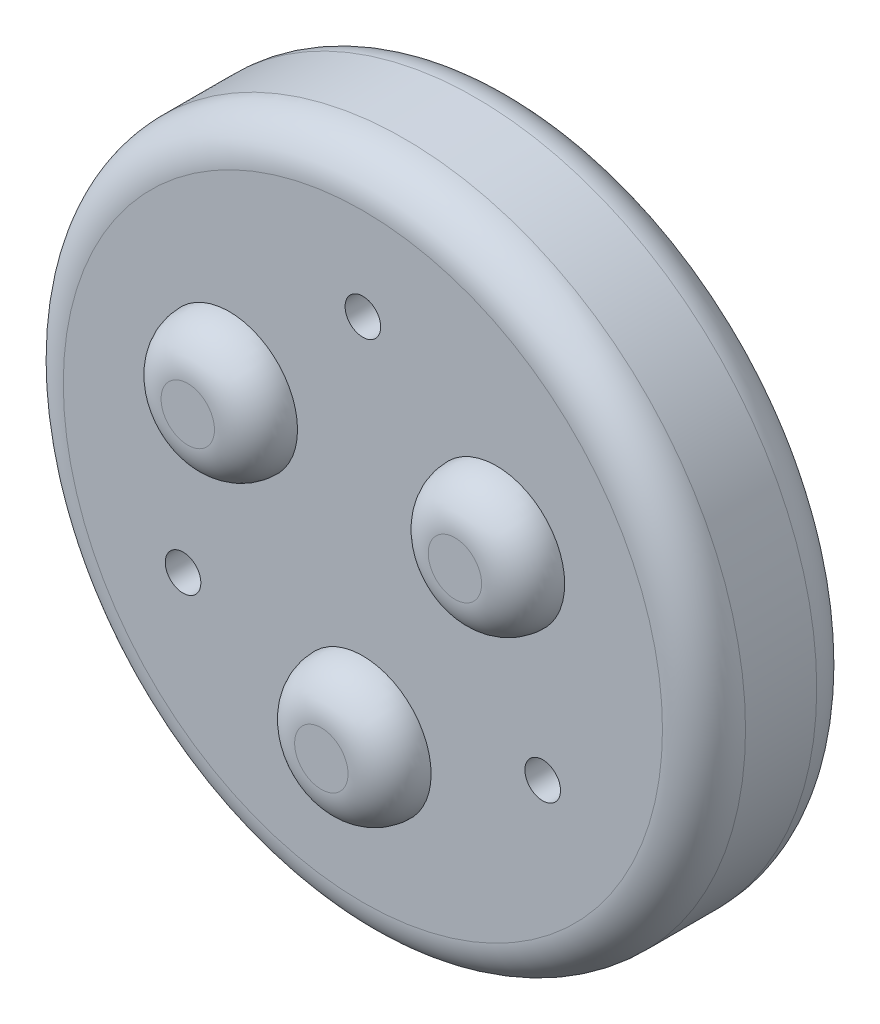
ISO-10303-21;
HEADER;
FILE_DESCRIPTION(('STEP AP214'),'2;1');
FILE_NAME('part.step','',(''),(''),'','','');
FILE_SCHEMA(('AUTOMOTIVE_DESIGN { 1 0 10303 214 1 1 1 1 }'));
ENDSEC;
DATA;
#1=APPLICATION_CONTEXT('core data for automotive mechanical design processes');
#2=APPLICATION_PROTOCOL_DEFINITION('international standard','automotive_design',2000,#1);
#3=PRODUCT_CONTEXT('',#1,'mechanical');
#4=PRODUCT('Part','Part','',(#3));
#5=PRODUCT_RELATED_PRODUCT_CATEGORY('part','',(#4));
#6=PRODUCT_DEFINITION_FORMATION('','',#4);
#7=PRODUCT_DEFINITION_CONTEXT('part definition',#1,'design');
#8=PRODUCT_DEFINITION('design','',#6,#7);
#9=PRODUCT_DEFINITION_SHAPE('','',#8);
#10=(LENGTH_UNIT() NAMED_UNIT(*) SI_UNIT(.MILLI.,.METRE.));
#11=(NAMED_UNIT(*) PLANE_ANGLE_UNIT() SI_UNIT($,.RADIAN.));
#12=(NAMED_UNIT(*) SI_UNIT($,.STERADIAN.) SOLID_ANGLE_UNIT());
#13=UNCERTAINTY_MEASURE_WITH_UNIT(LENGTH_MEASURE(1.E-05),#10,'distance_accuracy_value','');
#14=(GEOMETRIC_REPRESENTATION_CONTEXT(3) GLOBAL_UNCERTAINTY_ASSIGNED_CONTEXT((#13)) GLOBAL_UNIT_ASSIGNED_CONTEXT((#10,
#11,#12)) REPRESENTATION_CONTEXT('',''));
#15=CARTESIAN_POINT('',(0.,0.,0.));
#16=DIRECTION('',(0.,0.,1.));
#17=DIRECTION('',(1.,0.,0.));
#18=AXIS2_PLACEMENT_3D('',#15,#16,#17);
#19=CARTESIAN_POINT('',(0.,-26.,26.));
#20=DIRECTION('',(0.,0.,1.));
#21=DIRECTION('',(1.,0.,0.));
#22=AXIS2_PLACEMENT_3D('',#19,#20,#21);
#23=DEGENERATE_TOROIDAL_SURFACE('',#22,4.5,7.,.T.);
#24=CARTESIAN_POINT('',(0.,-26.,33.));
#25=DIRECTION('',(0.,0.,1.));
#26=DIRECTION('',(1.,0.,0.));
#27=AXIS2_PLACEMENT_3D('',#24,#25,#26);
#28=CIRCLE('',#27,4.5);
#29=CARTESIAN_POINT('',(4.5,-26.,33.));
#30=VERTEX_POINT('',#29);
#31=EDGE_CURVE('E12',#30,#30,#28,.T.);
#32=ORIENTED_EDGE('',*,*,#31,.F.);
#33=EDGE_LOOP('',(#32));
#34=FACE_BOUND('',#33,.T.);
#35=CARTESIAN_POINT('',(0.,-26.,26.));
#36=DIRECTION('',(0.,0.,1.));
#37=DIRECTION('',(1.,0.,0.));
#38=AXIS2_PLACEMENT_3D('',#35,#36,#37);
#39=CIRCLE('',#38,11.5);
#40=CARTESIAN_POINT('',(11.5,-26.,26.));
#41=VERTEX_POINT('',#40);
#42=EDGE_CURVE('E181',#41,#41,#39,.T.);
#43=ORIENTED_EDGE('',*,*,#42,.T.);
#44=EDGE_LOOP('',(#43));
#45=FACE_BOUND('',#44,.T.);
#46=ADVANCED_FACE('F40',(#34,#45),#23,.T.);
#47=CARTESIAN_POINT('',(22.5166604983954,13.,26.));
#48=DIRECTION('',(0.,0.,1.));
#49=DIRECTION('',(1.,0.,0.));
#50=AXIS2_PLACEMENT_3D('',#47,#48,#49);
#51=DEGENERATE_TOROIDAL_SURFACE('',#50,4.5,7.,.T.);
#52=CARTESIAN_POINT('',(22.5166604983954,13.,33.));
#53=DIRECTION('',(0.,0.,1.));
#54=DIRECTION('',(1.,0.,0.));
#55=AXIS2_PLACEMENT_3D('',#52,#53,#54);
#56=CIRCLE('',#55,4.5);
#57=CARTESIAN_POINT('',(27.0166604983954,13.,33.));
#58=VERTEX_POINT('',#57);
#59=EDGE_CURVE('E47',#58,#58,#56,.T.);
#60=ORIENTED_EDGE('',*,*,#59,.F.);
#61=EDGE_LOOP('',(#60));
#62=FACE_BOUND('',#61,.T.);
#63=CARTESIAN_POINT('',(22.5166604983954,13.,26.));
#64=DIRECTION('',(0.,0.,1.));
#65=DIRECTION('',(1.,0.,0.));
#66=AXIS2_PLACEMENT_3D('',#63,#64,#65);
#67=CIRCLE('',#66,11.5);
#68=CARTESIAN_POINT('',(34.0166604983954,13.,26.));
#69=VERTEX_POINT('',#68);
#70=EDGE_CURVE('E178',#69,#69,#67,.T.);
#71=ORIENTED_EDGE('',*,*,#70,.T.);
#72=EDGE_LOOP('',(#71));
#73=FACE_BOUND('',#72,.T.);
#74=ADVANCED_FACE('F172',(#62,#73),#51,.T.);
#75=CARTESIAN_POINT('',(-22.5166604983955,12.9999999999999,26.));
#76=DIRECTION('',(0.,0.,1.));
#77=DIRECTION('',(1.,0.,0.));
#78=AXIS2_PLACEMENT_3D('',#75,#76,#77);
#79=DEGENERATE_TOROIDAL_SURFACE('',#78,4.5,7.,.T.);
#80=CARTESIAN_POINT('',(-22.5166604983955,12.9999999999999,33.));
#81=DIRECTION('',(0.,0.,1.));
#82=DIRECTION('',(1.,0.,0.));
#83=AXIS2_PLACEMENT_3D('',#80,#81,#82);
#84=CIRCLE('',#83,4.5);
#85=CARTESIAN_POINT('',(-18.0166604983955,12.9999999999999,33.));
#86=VERTEX_POINT('',#85);
#87=EDGE_CURVE('E165',#86,#86,#84,.T.);
#88=ORIENTED_EDGE('',*,*,#87,.F.);
#89=EDGE_LOOP('',(#88));
#90=FACE_BOUND('',#89,.T.);
#91=CARTESIAN_POINT('',(-22.5166604983955,12.9999999999999,26.));
#92=DIRECTION('',(0.,0.,1.));
#93=DIRECTION('',(1.,0.,0.));
#94=AXIS2_PLACEMENT_3D('',#91,#92,#93);
#95=CIRCLE('',#94,11.5);
#96=CARTESIAN_POINT('',(-11.0166604983955,12.9999999999999,26.));
#97=VERTEX_POINT('',#96);
#98=EDGE_CURVE('E180',#97,#97,#95,.T.);
#99=ORIENTED_EDGE('',*,*,#98,.T.);
#100=EDGE_LOOP('',(#99));
#101=FACE_BOUND('',#100,.T.);
#102=ADVANCED_FACE('F175',(#90,#101),#79,.T.);
#103=CARTESIAN_POINT('',(5.,29.,8.5));
#104=DIRECTION('',(0.,0.,1.));
#105=DIRECTION('',(1.,0.,0.));
#106=AXIS2_PLACEMENT_3D('',#103,#104,#105);
#107=CYLINDRICAL_SURFACE('',#106,3.);
#108=DIRECTION('',(0.,0.,-1.));
#109=VECTOR('',#108,1.);
#110=CARTESIAN_POINT('',(5.,26.,8.5));
#111=LINE('',#110,#109);
#112=CARTESIAN_POINT('',(5.,26.,8.5));
#113=VERTEX_POINT('',#112);
#114=CARTESIAN_POINT('',(5.,26.,0.));
#115=VERTEX_POINT('',#114);
#116=EDGE_CURVE('E158',#113,#115,#111,.T.);
#117=ORIENTED_EDGE('',*,*,#116,.F.);
#118=CARTESIAN_POINT('',(5.,29.,8.5));
#119=DIRECTION('',(0.,0.,1.));
#120=DIRECTION('',(1.,0.,0.));
#121=AXIS2_PLACEMENT_3D('',#118,#119,#120);
#122=CIRCLE('',#121,3.);
#123=CARTESIAN_POINT('',(8.,29.,8.5));
#124=VERTEX_POINT('',#123);
#125=EDGE_CURVE('E61',#124,#113,#122,.F.);
#126=ORIENTED_EDGE('',*,*,#125,.F.);
#127=DIRECTION('',(0.,0.,-1.));
#128=VECTOR('',#127,1.);
#129=CARTESIAN_POINT('',(8.,29.,8.5));
#130=LINE('',#129,#128);
#131=CARTESIAN_POINT('',(8.,29.,0.));
#132=VERTEX_POINT('',#131);
#133=EDGE_CURVE('E161',#132,#124,#130,.F.);
#134=ORIENTED_EDGE('',*,*,#133,.F.);
#135=CARTESIAN_POINT('',(5.,29.,0.));
#136=DIRECTION('',(0.,0.,1.));
#137=DIRECTION('',(1.,0.,0.));
#138=AXIS2_PLACEMENT_3D('',#135,#136,#137);
#139=CIRCLE('',#138,3.);
#140=EDGE_CURVE('E54',#132,#115,#139,.F.);
#141=ORIENTED_EDGE('',*,*,#140,.T.);
#142=EDGE_LOOP('',(#117,#126,#134,#141));
#143=FACE_BOUND('',#142,.T.);
#144=ADVANCED_FACE('F342',(#143),#107,.F.);
#145=CARTESIAN_POINT('',(-5.,29.,8.5));
#146=DIRECTION('',(0.,0.,-1.));
#147=DIRECTION('',(-1.,0.,0.));
#148=AXIS2_PLACEMENT_3D('',#145,#146,#147);
#149=CYLINDRICAL_SURFACE('',#148,3.);
#150=DIRECTION('',(0.,0.,-1.));
#151=VECTOR('',#150,1.);
#152=CARTESIAN_POINT('',(-8.,29.,8.5));
#153=LINE('',#152,#151);
#154=CARTESIAN_POINT('',(-8.,29.,8.5));
#155=VERTEX_POINT('',#154);
#156=CARTESIAN_POINT('',(-8.,29.,0.));
#157=VERTEX_POINT('',#156);
#158=EDGE_CURVE('E148',#155,#157,#153,.T.);
#159=ORIENTED_EDGE('',*,*,#158,.F.);
#160=CARTESIAN_POINT('',(-5.,29.,8.5));
#161=DIRECTION('',(0.,0.,1.));
#162=DIRECTION('',(1.,0.,0.));
#163=AXIS2_PLACEMENT_3D('',#160,#161,#162);
#164=CIRCLE('',#163,3.);
#165=CARTESIAN_POINT('',(-5.,26.,8.5));
#166=VERTEX_POINT('',#165);
#167=EDGE_CURVE('E154',#166,#155,#164,.F.);
#168=ORIENTED_EDGE('',*,*,#167,.F.);
#169=DIRECTION('',(0.,0.,-1.));
#170=VECTOR('',#169,1.);
#171=CARTESIAN_POINT('',(-5.,26.,8.5));
#172=LINE('',#171,#170);
#173=CARTESIAN_POINT('',(-5.,26.,0.));
#174=VERTEX_POINT('',#173);
#175=EDGE_CURVE('E151',#174,#166,#172,.F.);
#176=ORIENTED_EDGE('',*,*,#175,.F.);
#177=CARTESIAN_POINT('',(-5.,29.,0.));
#178=DIRECTION('',(0.,0.,1.));
#179=DIRECTION('',(1.,0.,0.));
#180=AXIS2_PLACEMENT_3D('',#177,#178,#179);
#181=CIRCLE('',#180,3.);
#182=EDGE_CURVE('E156',#174,#157,#181,.F.);
#183=ORIENTED_EDGE('',*,*,#182,.T.);
#184=EDGE_LOOP('',(#159,#168,#176,#183));
#185=FACE_BOUND('',#184,.T.);
#186=ADVANCED_FACE('F353',(#185),#149,.F.);
#187=CARTESIAN_POINT('',(-5.,40.,8.5));
#188=DIRECTION('',(0.,0.,-1.));
#189=DIRECTION('',(-1.,0.,0.));
#190=AXIS2_PLACEMENT_3D('',#187,#188,#189);
#191=CYLINDRICAL_SURFACE('',#190,3.);
#192=DIRECTION('',(0.,0.,-1.));
#193=VECTOR('',#192,1.);
#194=CARTESIAN_POINT('',(-5.,43.,8.5));
#195=LINE('',#194,#193);
#196=CARTESIAN_POINT('',(-5.,43.,8.5));
#197=VERTEX_POINT('',#196);
#198=CARTESIAN_POINT('',(-5.,43.,0.));
#199=VERTEX_POINT('',#198);
#200=EDGE_CURVE('E121',#197,#199,#195,.T.);
#201=ORIENTED_EDGE('',*,*,#200,.F.);
#202=CARTESIAN_POINT('',(-5.,40.,8.5));
#203=DIRECTION('',(0.,0.,1.));
#204=DIRECTION('',(1.,0.,0.));
#205=AXIS2_PLACEMENT_3D('',#202,#203,#204);
#206=CIRCLE('',#205,3.);
#207=CARTESIAN_POINT('',(-8.,40.,8.5));
#208=VERTEX_POINT('',#207);
#209=EDGE_CURVE('E144',#208,#197,#206,.F.);
#210=ORIENTED_EDGE('',*,*,#209,.F.);
#211=DIRECTION('',(0.,0.,-1.));
#212=VECTOR('',#211,1.);
#213=CARTESIAN_POINT('',(-8.,40.,8.5));
#214=LINE('',#213,#212);
#215=CARTESIAN_POINT('',(-8.,40.,0.));
#216=VERTEX_POINT('',#215);
#217=EDGE_CURVE('E141',#216,#208,#214,.F.);
#218=ORIENTED_EDGE('',*,*,#217,.F.);
#219=CARTESIAN_POINT('',(-5.,40.,0.));
#220=DIRECTION('',(0.,0.,1.));
#221=DIRECTION('',(1.,0.,0.));
#222=AXIS2_PLACEMENT_3D('',#219,#220,#221);
#223=CIRCLE('',#222,3.);
#224=EDGE_CURVE('E146',#216,#199,#223,.F.);
#225=ORIENTED_EDGE('',*,*,#224,.T.);
#226=EDGE_LOOP('',(#201,#210,#218,#225));
#227=FACE_BOUND('',#226,.T.);
#228=ADVANCED_FACE('F362',(#227),#191,.F.);
#229=CARTESIAN_POINT('',(5.,40.,8.5));
#230=DIRECTION('',(0.,0.,1.));
#231=DIRECTION('',(1.,0.,0.));
#232=AXIS2_PLACEMENT_3D('',#229,#230,#231);
#233=CYLINDRICAL_SURFACE('',#232,3.);
#234=DIRECTION('',(0.,0.,-1.));
#235=VECTOR('',#234,1.);
#236=CARTESIAN_POINT('',(8.,40.,8.5));
#237=LINE('',#236,#235);
#238=CARTESIAN_POINT('',(8.,40.,8.5));
#239=VERTEX_POINT('',#238);
#240=CARTESIAN_POINT('',(8.,40.,0.));
#241=VERTEX_POINT('',#240);
#242=EDGE_CURVE('E117',#239,#241,#237,.T.);
#243=ORIENTED_EDGE('',*,*,#242,.F.);
#244=CARTESIAN_POINT('',(5.,40.,8.5));
#245=DIRECTION('',(0.,0.,1.));
#246=DIRECTION('',(1.,0.,0.));
#247=AXIS2_PLACEMENT_3D('',#244,#245,#246);
#248=CIRCLE('',#247,3.);
#249=CARTESIAN_POINT('',(5.,43.,8.5));
#250=VERTEX_POINT('',#249);
#251=EDGE_CURVE('E122',#250,#239,#248,.F.);
#252=ORIENTED_EDGE('',*,*,#251,.F.);
#253=DIRECTION('',(0.,0.,-1.));
#254=VECTOR('',#253,1.);
#255=CARTESIAN_POINT('',(5.,43.,8.5));
#256=LINE('',#255,#254);
#257=CARTESIAN_POINT('',(5.,43.,0.));
#258=VERTEX_POINT('',#257);
#259=EDGE_CURVE('E119',#258,#250,#256,.F.);
#260=ORIENTED_EDGE('',*,*,#259,.F.);
#261=CARTESIAN_POINT('',(5.,40.,0.));
#262=DIRECTION('',(0.,0.,1.));
#263=DIRECTION('',(1.,0.,0.));
#264=AXIS2_PLACEMENT_3D('',#261,#262,#263);
#265=CIRCLE('',#264,3.);
#266=EDGE_CURVE('E107',#258,#241,#265,.F.);
#267=ORIENTED_EDGE('',*,*,#266,.T.);
#268=EDGE_LOOP('',(#243,#252,#260,#267));
#269=FACE_BOUND('',#268,.T.);
#270=ADVANCED_FACE('F116',(#269),#233,.F.);
#271=CARTESIAN_POINT('',(0.,35.,91.5));
#272=DIRECTION('',(0.,0.,-1.));
#273=DIRECTION('',(-1.,0.,0.));
#274=AXIS2_PLACEMENT_3D('',#271,#272,#273);
#275=CYLINDRICAL_SURFACE('',#274,1.5);
#276=CARTESIAN_POINT('',(0.,35.,14.));
#277=DIRECTION('',(0.,0.,1.));
#278=DIRECTION('',(1.,0.,0.));
#279=AXIS2_PLACEMENT_3D('',#276,#277,#278);
#280=CIRCLE('',#279,1.5);
#281=CARTESIAN_POINT('',(1.5,35.,14.));
#282=VERTEX_POINT('',#281);
#283=EDGE_CURVE('E207',#282,#282,#280,.T.);
#284=ORIENTED_EDGE('',*,*,#283,.F.);
#285=EDGE_LOOP('',(#284));
#286=FACE_BOUND('',#285,.T.);
#287=CARTESIAN_POINT('',(0.,35.,15.));
#288=DIRECTION('',(0.,0.,1.));
#289=DIRECTION('',(1.,0.,0.));
#290=AXIS2_PLACEMENT_3D('',#287,#288,#289);
#291=CIRCLE('',#290,1.5);
#292=CARTESIAN_POINT('',(1.5,35.,15.));
#293=VERTEX_POINT('',#292);
#294=EDGE_CURVE('E203',#293,#293,#291,.T.);
#295=ORIENTED_EDGE('',*,*,#294,.T.);
#296=EDGE_LOOP('',(#295));
#297=FACE_BOUND('',#296,.T.);
#298=ADVANCED_FACE('F380',(#286,#297),#275,.F.);
#299=CARTESIAN_POINT('',(0.,0.,0.));
#300=DIRECTION('',(0.,0.,1.));
#301=DIRECTION('',(1.,0.,0.));
#302=AXIS2_PLACEMENT_3D('',#299,#300,#301);
#303=PLANE('',#302);
#304=ORIENTED_EDGE('',*,*,#140,.F.);
#305=DIRECTION('',(0.,1.,0.));
#306=VECTOR('',#305,1.);
#307=CARTESIAN_POINT('',(8.,26.,0.));
#308=LINE('',#307,#306);
#309=EDGE_CURVE('E102',#132,#241,#308,.T.);
#310=ORIENTED_EDGE('',*,*,#309,.T.);
#311=ORIENTED_EDGE('',*,*,#266,.F.);
#312=DIRECTION('',(-1.,0.,0.));
#313=VECTOR('',#312,1.);
#314=CARTESIAN_POINT('',(8.,43.,0.));
#315=LINE('',#314,#313);
#316=EDGE_CURVE('E111',#258,#199,#315,.T.);
#317=ORIENTED_EDGE('',*,*,#316,.T.);
#318=ORIENTED_EDGE('',*,*,#224,.F.);
#319=DIRECTION('',(0.,1.,0.));
#320=VECTOR('',#319,1.);
#321=CARTESIAN_POINT('',(-8.,26.,0.));
#322=LINE('',#321,#320);
#323=EDGE_CURVE('E219',#157,#216,#322,.T.);
#324=ORIENTED_EDGE('',*,*,#323,.F.);
#325=ORIENTED_EDGE('',*,*,#182,.F.);
#326=DIRECTION('',(1.,0.,0.));
#327=VECTOR('',#326,1.);
#328=CARTESIAN_POINT('',(0.,26.,0.));
#329=LINE('',#328,#327);
#330=EDGE_CURVE('E210',#174,#115,#329,.T.);
#331=ORIENTED_EDGE('',*,*,#330,.T.);
#332=EDGE_LOOP('',(#304,#310,#311,#317,#318,#324,#325,#331));
#333=FACE_BOUND('',#332,.T.);
#334=CARTESIAN_POINT('',(0.,0.,0.));
#335=DIRECTION('',(0.,0.,1.));
#336=DIRECTION('',(1.,0.,0.));
#337=AXIS2_PLACEMENT_3D('',#334,#335,#336);
#338=CIRCLE('',#337,50.5);
#339=CARTESIAN_POINT('',(50.5,0.,0.));
#340=VERTEX_POINT('',#339);
#341=EDGE_CURVE('E132',#340,#340,#338,.F.);
#342=ORIENTED_EDGE('',*,*,#341,.T.);
#343=EDGE_LOOP('',(#342));
#344=FACE_BOUND('',#343,.T.);
#345=ADVANCED_FACE('F104',(#333,#344),#303,.F.);
#346=CARTESIAN_POINT('',(0.,0.,26.));
#347=DIRECTION('',(0.,0.,-1.));
#348=DIRECTION('',(-1.,0.,0.));
#349=AXIS2_PLACEMENT_3D('',#346,#347,#348);
#350=CYLINDRICAL_SURFACE('',#349,57.5);
#351=CARTESIAN_POINT('',(0.,0.,7.));
#352=DIRECTION('',(0.,0.,1.));
#353=DIRECTION('',(1.,0.,0.));
#354=AXIS2_PLACEMENT_3D('',#351,#352,#353);
#355=CIRCLE('',#354,57.5);
#356=CARTESIAN_POINT('',(-57.5,0.,7.));
#357=VERTEX_POINT('',#356);
#358=EDGE_CURVE('E224',#357,#357,#355,.T.);
#359=CARTESIAN_POINT('',(0.,0.,19.));
#360=DIRECTION('',(0.,0.,1.));
#361=DIRECTION('',(1.,0.,0.));
#362=AXIS2_PLACEMENT_3D('',#359,#360,#361);
#363=CIRCLE('',#362,57.5);
#364=CARTESIAN_POINT('',(-57.5,0.,19.));
#365=VERTEX_POINT('',#364);
#366=EDGE_CURVE('E216',#365,#365,#363,.F.);
#367=CARTESIAN_POINT('',(-57.5,0.,7.));
#368=CARTESIAN_POINT('',(-57.5,0.,7.125));
#369=CARTESIAN_POINT('',(-57.5,0.,7.25));
#370=CARTESIAN_POINT('',(-57.5,0.,7.5));
#371=CARTESIAN_POINT('',(-57.5,0.,7.625));
#372=CARTESIAN_POINT('',(-57.5,0.,7.875));
#373=CARTESIAN_POINT('',(-57.5,0.,8.));
#374=CARTESIAN_POINT('',(-57.5,0.,8.25));
#375=CARTESIAN_POINT('',(-57.5,0.,8.375));
#376=CARTESIAN_POINT('',(-57.5,0.,8.625));
#377=CARTESIAN_POINT('',(-57.5,0.,8.75));
#378=CARTESIAN_POINT('',(-57.5,0.,9.));
#379=CARTESIAN_POINT('',(-57.5,0.,9.125));
#380=CARTESIAN_POINT('',(-57.5,0.,9.375));
#381=CARTESIAN_POINT('',(-57.5,0.,9.5));
#382=CARTESIAN_POINT('',(-57.5,0.,9.75));
#383=CARTESIAN_POINT('',(-57.5,0.,9.875));
#384=CARTESIAN_POINT('',(-57.5,0.,10.125));
#385=CARTESIAN_POINT('',(-57.5,0.,10.25));
#386=CARTESIAN_POINT('',(-57.5,0.,10.5));
#387=CARTESIAN_POINT('',(-57.5,0.,10.625));
#388=CARTESIAN_POINT('',(-57.5,0.,10.875));
#389=CARTESIAN_POINT('',(-57.5,0.,11.));
#390=CARTESIAN_POINT('',(-57.5,0.,11.25));
#391=CARTESIAN_POINT('',(-57.5,0.,11.375));
#392=CARTESIAN_POINT('',(-57.5,0.,11.625));
#393=CARTESIAN_POINT('',(-57.5,0.,11.75));
#394=CARTESIAN_POINT('',(-57.5,0.,12.));
#395=CARTESIAN_POINT('',(-57.5,0.,12.125));
#396=CARTESIAN_POINT('',(-57.5,0.,12.375));
#397=CARTESIAN_POINT('',(-57.5,0.,12.5));
#398=CARTESIAN_POINT('',(-57.5,0.,12.75));
#399=CARTESIAN_POINT('',(-57.5,0.,12.875));
#400=CARTESIAN_POINT('',(-57.5,0.,13.125));
#401=CARTESIAN_POINT('',(-57.5,0.,13.25));
#402=CARTESIAN_POINT('',(-57.5,0.,13.5));
#403=CARTESIAN_POINT('',(-57.5,0.,13.625));
#404=CARTESIAN_POINT('',(-57.5,0.,13.875));
#405=CARTESIAN_POINT('',(-57.5,0.,14.));
#406=CARTESIAN_POINT('',(-57.5,0.,14.25));
#407=CARTESIAN_POINT('',(-57.5,0.,14.375));
#408=CARTESIAN_POINT('',(-57.5,0.,14.625));
#409=CARTESIAN_POINT('',(-57.5,0.,14.75));
#410=CARTESIAN_POINT('',(-57.5,0.,15.));
#411=CARTESIAN_POINT('',(-57.5,0.,15.125));
#412=CARTESIAN_POINT('',(-57.5,0.,15.375));
#413=CARTESIAN_POINT('',(-57.5,0.,15.5));
#414=CARTESIAN_POINT('',(-57.5,0.,15.75));
#415=CARTESIAN_POINT('',(-57.5,0.,15.875));
#416=CARTESIAN_POINT('',(-57.5,0.,16.125));
#417=CARTESIAN_POINT('',(-57.5,0.,16.25));
#418=CARTESIAN_POINT('',(-57.5,0.,16.5));
#419=CARTESIAN_POINT('',(-57.5,0.,16.625));
#420=CARTESIAN_POINT('',(-57.5,0.,16.875));
#421=CARTESIAN_POINT('',(-57.5,0.,17.));
#422=CARTESIAN_POINT('',(-57.5,0.,17.25));
#423=CARTESIAN_POINT('',(-57.5,0.,17.375));
#424=CARTESIAN_POINT('',(-57.5,0.,17.625));
#425=CARTESIAN_POINT('',(-57.5,0.,17.75));
#426=CARTESIAN_POINT('',(-57.5,0.,18.));
#427=CARTESIAN_POINT('',(-57.5,0.,18.125));
#428=CARTESIAN_POINT('',(-57.5,0.,18.375));
#429=CARTESIAN_POINT('',(-57.5,0.,18.5));
#430=CARTESIAN_POINT('',(-57.5,0.,18.75));
#431=CARTESIAN_POINT('',(-57.5,0.,18.875));
#432=CARTESIAN_POINT('',(-57.5,0.,19.));
#433=B_SPLINE_CURVE_WITH_KNOTS('',3,(#367,#368,#369,#370,#371,#372,#373,#374,#375,#376,#377,
#378,#379,#380,#381,#382,#383,#384,#385,#386,#387,#388,#389,#390,#391,#392,#393,#394,#395,#396,
#397,#398,#399,#400,#401,#402,#403,#404,#405,#406,#407,#408,#409,#410,#411,#412,#413,#414,#415,
#416,#417,#418,#419,#420,#421,#422,#423,#424,#425,#426,#427,#428,#429,#430,#431,#432),
.UNSPECIFIED.,.F.,.F.,(4,2,2,2,2,2,2,2,2,2,2,2,2,2,2,2,2,2,2,2,2,2,2,2,2,2,2,2,2,2,2,2,4),(0.,
0.375,0.750000000000001,1.125,1.5,1.875,2.25,2.625,3.,3.375,3.75,4.125,4.5,4.875,5.25,5.625,6.,
6.375,6.75,7.125,7.5,7.875,8.25,8.625,9.,9.375,9.75,10.125,10.5,10.875,11.25,11.625,12.),.UNSPECIFIED.);
#434=EDGE_CURVE('BSEAM270',#357,#365,#433,.T.);
#435=ORIENTED_EDGE('',*,*,#358,.T.);
#436=ORIENTED_EDGE('',*,*,#366,.T.);
#437=ORIENTED_EDGE('',*,*,#434,.T.);
#438=ORIENTED_EDGE('',*,*,#434,.F.);
#439=EDGE_LOOP('',(#435,#437,#436,#438));
#440=FACE_BOUND('',#439,.T.);
#441=ADVANCED_FACE('F270',(#440),#350,.T.);
#442=CARTESIAN_POINT('',(0.,0.,26.));
#443=DIRECTION('',(0.,0.,1.));
#444=DIRECTION('',(1.,0.,0.));
#445=AXIS2_PLACEMENT_3D('',#442,#443,#444);
#446=PLANE('',#445);
#447=ORIENTED_EDGE('',*,*,#42,.F.);
#448=EDGE_LOOP('',(#447));
#449=FACE_BOUND('',#448,.T.);
#450=ORIENTED_EDGE('',*,*,#70,.F.);
#451=EDGE_LOOP('',(#450));
#452=FACE_BOUND('',#451,.T.);
#453=ORIENTED_EDGE('',*,*,#98,.F.);
#454=EDGE_LOOP('',(#453));
#455=FACE_BOUND('',#454,.T.);
#456=CARTESIAN_POINT('',(-30.3108891324555,-17.4999999999998,26.));
#457=DIRECTION('',(0.,0.,1.));
#458=DIRECTION('',(1.,0.,0.));
#459=AXIS2_PLACEMENT_3D('',#456,#457,#458);
#460=CIRCLE('',#459,3.);
#461=CARTESIAN_POINT('',(-27.3108891324555,-17.4999999999998,26.));
#462=VERTEX_POINT('',#461);
#463=EDGE_CURVE('E193',#462,#462,#460,.T.);
#464=ORIENTED_EDGE('',*,*,#463,.F.);
#465=EDGE_LOOP('',(#464));
#466=FACE_BOUND('',#465,.T.);
#467=CARTESIAN_POINT('',(30.3108891324555,-17.4999999999998,26.));
#468=DIRECTION('',(0.,0.,1.));
#469=DIRECTION('',(1.,0.,0.));
#470=AXIS2_PLACEMENT_3D('',#467,#468,#469);
#471=CIRCLE('',#470,2.99999999999999);
#472=CARTESIAN_POINT('',(33.3108891324555,-17.4999999999998,26.));
#473=VERTEX_POINT('',#472);
#474=EDGE_CURVE('E196',#473,#473,#471,.T.);
#475=ORIENTED_EDGE('',*,*,#474,.F.);
#476=EDGE_LOOP('',(#475));
#477=FACE_BOUND('',#476,.T.);
#478=CARTESIAN_POINT('',(0.,35.,26.));
#479=DIRECTION('',(0.,0.,1.));
#480=DIRECTION('',(1.,0.,0.));
#481=AXIS2_PLACEMENT_3D('',#478,#479,#480);
#482=CIRCLE('',#481,3.);
#483=CARTESIAN_POINT('',(3.,35.,26.));
#484=VERTEX_POINT('',#483);
#485=EDGE_CURVE('E135',#484,#484,#482,.F.);
#486=ORIENTED_EDGE('',*,*,#485,.T.);
#487=EDGE_LOOP('',(#486));
#488=FACE_BOUND('',#487,.T.);
#489=CARTESIAN_POINT('',(0.,0.,26.));
#490=DIRECTION('',(0.,0.,1.));
#491=DIRECTION('',(1.,0.,0.));
#492=AXIS2_PLACEMENT_3D('',#489,#490,#491);
#493=CIRCLE('',#492,50.5);
#494=CARTESIAN_POINT('',(50.5,0.,26.));
#495=VERTEX_POINT('',#494);
#496=EDGE_CURVE('E128',#495,#495,#493,.T.);
#497=ORIENTED_EDGE('',*,*,#496,.T.);
#498=EDGE_LOOP('',(#497));
#499=FACE_BOUND('',#498,.T.);
#500=ADVANCED_FACE('F238',(#449,#452,#455,#466,#477,#488,#499),#446,.T.);
#501=CARTESIAN_POINT('',(0.,0.,7.));
#502=DIRECTION('',(0.,0.,1.));
#503=DIRECTION('',(1.,0.,0.));
#504=AXIS2_PLACEMENT_3D('',#501,#502,#503);
#505=TOROIDAL_SURFACE('',#504,50.5,7.);
#506=ORIENTED_EDGE('',*,*,#341,.F.);
#507=EDGE_LOOP('',(#506));
#508=FACE_BOUND('',#507,.T.);
#509=ORIENTED_EDGE('',*,*,#358,.F.);
#510=EDGE_LOOP('',(#509));
#511=FACE_BOUND('',#510,.T.);
#512=ADVANCED_FACE('F269',(#508,#511),#505,.T.);
#513=CARTESIAN_POINT('',(0.,0.,19.));
#514=DIRECTION('',(0.,0.,1.));
#515=DIRECTION('',(1.,0.,0.));
#516=AXIS2_PLACEMENT_3D('',#513,#514,#515);
#517=TOROIDAL_SURFACE('',#516,50.5,7.);
#518=ORIENTED_EDGE('',*,*,#366,.F.);
#519=EDGE_LOOP('',(#518));
#520=FACE_BOUND('',#519,.T.);
#521=ORIENTED_EDGE('',*,*,#496,.F.);
#522=EDGE_LOOP('',(#521));
#523=FACE_BOUND('',#522,.T.);
#524=ADVANCED_FACE('F413',(#520,#523),#517,.T.);
#525=CARTESIAN_POINT('',(8.,26.,8.5));
#526=DIRECTION('',(-1.,0.,0.));
#527=DIRECTION('',(0.,-1.,0.));
#528=AXIS2_PLACEMENT_3D('',#525,#526,#527);
#529=PLANE('',#528);
#530=ORIENTED_EDGE('',*,*,#309,.F.);
#531=ORIENTED_EDGE('',*,*,#133,.T.);
#532=DIRECTION('',(0.,1.,0.));
#533=VECTOR('',#532,1.);
#534=CARTESIAN_POINT('',(8.,26.,8.5));
#535=LINE('',#534,#533);
#536=EDGE_CURVE('E126',#124,#239,#535,.T.);
#537=ORIENTED_EDGE('',*,*,#536,.T.);
#538=ORIENTED_EDGE('',*,*,#242,.T.);
#539=EDGE_LOOP('',(#530,#531,#537,#538));
#540=FACE_BOUND('',#539,.T.);
#541=ADVANCED_FACE('F124',(#540),#529,.T.);
#542=CARTESIAN_POINT('',(8.,43.,8.5));
#543=DIRECTION('',(0.,-1.,0.));
#544=DIRECTION('',(0.,0.,-1.));
#545=AXIS2_PLACEMENT_3D('',#542,#543,#544);
#546=PLANE('',#545);
#547=DIRECTION('',(-1.,0.,0.));
#548=VECTOR('',#547,1.);
#549=CARTESIAN_POINT('',(8.,43.,8.5));
#550=LINE('',#549,#548);
#551=EDGE_CURVE('E209',#250,#197,#550,.T.);
#552=ORIENTED_EDGE('',*,*,#551,.T.);
#553=ORIENTED_EDGE('',*,*,#200,.T.);
#554=ORIENTED_EDGE('',*,*,#316,.F.);
#555=ORIENTED_EDGE('',*,*,#259,.T.);
#556=EDGE_LOOP('',(#552,#553,#554,#555));
#557=FACE_BOUND('',#556,.T.);
#558=ADVANCED_FACE('F426',(#557),#546,.T.);
#559=CARTESIAN_POINT('',(-8.,26.,8.5));
#560=DIRECTION('',(-1.,0.,0.));
#561=DIRECTION('',(0.,0.,1.));
#562=AXIS2_PLACEMENT_3D('',#559,#560,#561);
#563=PLANE('',#562);
#564=DIRECTION('',(0.,1.,0.));
#565=VECTOR('',#564,1.);
#566=CARTESIAN_POINT('',(-8.,26.,8.5));
#567=LINE('',#566,#565);
#568=EDGE_CURVE('E213',#155,#208,#567,.T.);
#569=ORIENTED_EDGE('',*,*,#568,.F.);
#570=ORIENTED_EDGE('',*,*,#158,.T.);
#571=ORIENTED_EDGE('',*,*,#323,.T.);
#572=ORIENTED_EDGE('',*,*,#217,.T.);
#573=EDGE_LOOP('',(#569,#570,#571,#572));
#574=FACE_BOUND('',#573,.T.);
#575=ADVANCED_FACE('F432',(#574),#563,.F.);
#576=CARTESIAN_POINT('',(0.,26.,8.5));
#577=DIRECTION('',(0.,1.,0.));
#578=DIRECTION('',(0.,0.,1.));
#579=AXIS2_PLACEMENT_3D('',#576,#577,#578);
#580=PLANE('',#579);
#581=DIRECTION('',(-1.,0.,0.));
#582=VECTOR('',#581,1.);
#583=CARTESIAN_POINT('',(0.,26.,8.5));
#584=LINE('',#583,#582);
#585=EDGE_CURVE('E215',#113,#166,#584,.T.);
#586=ORIENTED_EDGE('',*,*,#585,.F.);
#587=ORIENTED_EDGE('',*,*,#116,.T.);
#588=ORIENTED_EDGE('',*,*,#330,.F.);
#589=ORIENTED_EDGE('',*,*,#175,.T.);
#590=EDGE_LOOP('',(#586,#587,#588,#589));
#591=FACE_BOUND('',#590,.T.);
#592=ADVANCED_FACE('F439',(#591),#580,.T.);
#593=CARTESIAN_POINT('',(0.,0.,8.5));
#594=DIRECTION('',(0.,0.,1.));
#595=DIRECTION('',(1.,0.,0.));
#596=AXIS2_PLACEMENT_3D('',#593,#594,#595);
#597=PLANE('',#596);
#598=CARTESIAN_POINT('',(0.,35.,8.5));
#599=DIRECTION('',(0.,0.,1.));
#600=DIRECTION('',(1.,0.,0.));
#601=AXIS2_PLACEMENT_3D('',#598,#599,#600);
#602=CIRCLE('',#601,3.);
#603=CARTESIAN_POINT('',(3.,35.,8.5));
#604=VERTEX_POINT('',#603);
#605=EDGE_CURVE('E112',#604,#604,#602,.F.);
#606=ORIENTED_EDGE('',*,*,#605,.F.);
#607=EDGE_LOOP('',(#606));
#608=FACE_BOUND('',#607,.T.);
#609=ORIENTED_EDGE('',*,*,#536,.F.);
#610=ORIENTED_EDGE('',*,*,#125,.T.);
#611=ORIENTED_EDGE('',*,*,#585,.T.);
#612=ORIENTED_EDGE('',*,*,#167,.T.);
#613=ORIENTED_EDGE('',*,*,#568,.T.);
#614=ORIENTED_EDGE('',*,*,#209,.T.);
#615=ORIENTED_EDGE('',*,*,#551,.F.);
#616=ORIENTED_EDGE('',*,*,#251,.T.);
#617=EDGE_LOOP('',(#609,#610,#611,#612,#613,#614,#615,#616));
#618=FACE_BOUND('',#617,.T.);
#619=ADVANCED_FACE('F446',(#608,#618),#597,.F.);
#620=CARTESIAN_POINT('',(0.,35.,14.));
#621=DIRECTION('',(0.,0.,-1.));
#622=DIRECTION('',(-1.,0.,0.));
#623=AXIS2_PLACEMENT_3D('',#620,#621,#622);
#624=CYLINDRICAL_SURFACE('',#623,3.);
#625=CARTESIAN_POINT('',(0.,35.,14.));
#626=DIRECTION('',(0.,0.,1.));
#627=DIRECTION('',(1.,0.,0.));
#628=AXIS2_PLACEMENT_3D('',#625,#626,#627);
#629=CIRCLE('',#628,3.);
#630=CARTESIAN_POINT('',(3.,35.,14.));
#631=VERTEX_POINT('',#630);
#632=EDGE_CURVE('E204',#631,#631,#629,.T.);
#633=ORIENTED_EDGE('',*,*,#632,.T.);
#634=EDGE_LOOP('',(#633));
#635=FACE_BOUND('',#634,.T.);
#636=ORIENTED_EDGE('',*,*,#605,.T.);
#637=EDGE_LOOP('',(#636));
#638=FACE_BOUND('',#637,.T.);
#639=ADVANCED_FACE('F453',(#635,#638),#624,.F.);
#640=CARTESIAN_POINT('',(0.,35.,14.));
#641=DIRECTION('',(0.,0.,1.));
#642=DIRECTION('',(1.,0.,0.));
#643=AXIS2_PLACEMENT_3D('',#640,#641,#642);
#644=PLANE('',#643);
#645=ORIENTED_EDGE('',*,*,#283,.T.);
#646=EDGE_LOOP('',(#645));
#647=FACE_BOUND('',#646,.T.);
#648=ORIENTED_EDGE('',*,*,#632,.F.);
#649=EDGE_LOOP('',(#648));
#650=FACE_BOUND('',#649,.T.);
#651=ADVANCED_FACE('F245',(#647,#650),#644,.F.);
#652=CARTESIAN_POINT('',(0.,35.,82.));
#653=DIRECTION('',(0.,0.,-1.));
#654=DIRECTION('',(-1.,0.,0.));
#655=AXIS2_PLACEMENT_3D('',#652,#653,#654);
#656=CYLINDRICAL_SURFACE('',#655,3.);
#657=ORIENTED_EDGE('',*,*,#485,.F.);
#658=EDGE_LOOP('',(#657));
#659=FACE_BOUND('',#658,.T.);
#660=CARTESIAN_POINT('',(0.,35.,15.));
#661=DIRECTION('',(0.,0.,1.));
#662=DIRECTION('',(1.,0.,0.));
#663=AXIS2_PLACEMENT_3D('',#660,#661,#662);
#664=CIRCLE('',#663,3.);
#665=CARTESIAN_POINT('',(3.,35.,15.));
#666=VERTEX_POINT('',#665);
#667=EDGE_CURVE('E192',#666,#666,#664,.T.);
#668=ORIENTED_EDGE('',*,*,#667,.F.);
#669=EDGE_LOOP('',(#668));
#670=FACE_BOUND('',#669,.T.);
#671=ADVANCED_FACE('F241',(#659,#670),#656,.F.);
#672=CARTESIAN_POINT('',(0.,35.,15.));
#673=DIRECTION('',(0.,0.,1.));
#674=DIRECTION('',(1.,0.,0.));
#675=AXIS2_PLACEMENT_3D('',#672,#673,#674);
#676=PLANE('',#675);
#677=ORIENTED_EDGE('',*,*,#294,.F.);
#678=EDGE_LOOP('',(#677));
#679=FACE_BOUND('',#678,.T.);
#680=ORIENTED_EDGE('',*,*,#667,.T.);
#681=EDGE_LOOP('',(#680));
#682=FACE_BOUND('',#681,.T.);
#683=ADVANCED_FACE('F244',(#679,#682),#676,.T.);
#684=CARTESIAN_POINT('',(30.3108891324555,-17.4999999999998,16.));
#685=DIRECTION('',(0.,0.,1.));
#686=DIRECTION('',(1.,0.,0.));
#687=AXIS2_PLACEMENT_3D('',#684,#685,#686);
#688=CYLINDRICAL_SURFACE('',#687,2.99999999999999);
#689=CARTESIAN_POINT('',(30.3108891324555,-17.4999999999998,16.));
#690=DIRECTION('',(0.,0.,1.));
#691=DIRECTION('',(1.,0.,0.));
#692=AXIS2_PLACEMENT_3D('',#689,#690,#691);
#693=CIRCLE('',#692,2.99999999999999);
#694=CARTESIAN_POINT('',(33.3108891324555,-17.4999999999998,16.));
#695=VERTEX_POINT('',#694);
#696=EDGE_CURVE('E184',#695,#695,#693,.T.);
#697=ORIENTED_EDGE('',*,*,#696,.F.);
#698=EDGE_LOOP('',(#697));
#699=FACE_BOUND('',#698,.T.);
#700=ORIENTED_EDGE('',*,*,#474,.T.);
#701=EDGE_LOOP('',(#700));
#702=FACE_BOUND('',#701,.T.);
#703=ADVANCED_FACE('F250',(#699,#702),#688,.F.);
#704=CARTESIAN_POINT('',(30.3108891324555,-17.4999999999998,16.));
#705=DIRECTION('',(0.,0.,1.));
#706=DIRECTION('',(1.,0.,0.));
#707=AXIS2_PLACEMENT_3D('',#704,#705,#706);
#708=PLANE('',#707);
#709=ORIENTED_EDGE('',*,*,#696,.T.);
#710=EDGE_LOOP('',(#709));
#711=FACE_BOUND('',#710,.T.);
#712=ADVANCED_FACE('F256',(#711),#708,.T.);
#713=CARTESIAN_POINT('',(-30.3108891324555,-17.4999999999998,16.));
#714=DIRECTION('',(0.,0.,1.));
#715=DIRECTION('',(1.,0.,0.));
#716=AXIS2_PLACEMENT_3D('',#713,#714,#715);
#717=CYLINDRICAL_SURFACE('',#716,3.);
#718=CARTESIAN_POINT('',(-30.3108891324555,-17.4999999999998,16.));
#719=DIRECTION('',(0.,0.,1.));
#720=DIRECTION('',(1.,0.,0.));
#721=AXIS2_PLACEMENT_3D('',#718,#719,#720);
#722=CIRCLE('',#721,3.);
#723=CARTESIAN_POINT('',(-27.3108891324555,-17.4999999999998,16.));
#724=VERTEX_POINT('',#723);
#725=EDGE_CURVE('E189',#724,#724,#722,.T.);
#726=ORIENTED_EDGE('',*,*,#725,.F.);
#727=EDGE_LOOP('',(#726));
#728=FACE_BOUND('',#727,.T.);
#729=ORIENTED_EDGE('',*,*,#463,.T.);
#730=EDGE_LOOP('',(#729));
#731=FACE_BOUND('',#730,.T.);
#732=ADVANCED_FACE('F280',(#728,#731),#717,.F.);
#733=CARTESIAN_POINT('',(-30.3108891324555,-17.4999999999998,16.));
#734=DIRECTION('',(0.,0.,1.));
#735=DIRECTION('',(1.,0.,0.));
#736=AXIS2_PLACEMENT_3D('',#733,#734,#735);
#737=PLANE('',#736);
#738=ORIENTED_EDGE('',*,*,#725,.T.);
#739=EDGE_LOOP('',(#738));
#740=FACE_BOUND('',#739,.T.);
#741=ADVANCED_FACE('F282',(#740),#737,.T.);
#742=CARTESIAN_POINT('',(-22.5166604983955,12.9999999999999,33.));
#743=DIRECTION('',(0.,0.,1.));
#744=DIRECTION('',(1.,0.,0.));
#745=AXIS2_PLACEMENT_3D('',#742,#743,#744);
#746=PLANE('',#745);
#747=ORIENTED_EDGE('',*,*,#87,.T.);
#748=EDGE_LOOP('',(#747));
#749=FACE_BOUND('',#748,.T.);
#750=ADVANCED_FACE('F289',(#749),#746,.T.);
#751=CARTESIAN_POINT('',(22.5166604983954,13.,33.));
#752=DIRECTION('',(0.,0.,1.));
#753=DIRECTION('',(1.,0.,0.));
#754=AXIS2_PLACEMENT_3D('',#751,#752,#753);
#755=PLANE('',#754);
#756=ORIENTED_EDGE('',*,*,#59,.T.);
#757=EDGE_LOOP('',(#756));
#758=FACE_BOUND('',#757,.T.);
#759=ADVANCED_FACE('F170',(#758),#755,.T.);
#760=CARTESIAN_POINT('',(0.,-26.,33.));
#761=DIRECTION('',(0.,0.,1.));
#762=DIRECTION('',(1.,0.,0.));
#763=AXIS2_PLACEMENT_3D('',#760,#761,#762);
#764=PLANE('',#763);
#765=ORIENTED_EDGE('',*,*,#31,.T.);
#766=EDGE_LOOP('',(#765));
#767=FACE_BOUND('',#766,.T.);
#768=ADVANCED_FACE('F300',(#767),#764,.T.);
#769=CLOSED_SHELL('',(#46,#74,#102,#144,#186,#228,#270,#298,#345,#441,#500,#512,#524,#541,#558,
#575,#592,#619,#639,#651,#671,#683,#703,#712,#732,#741,#750,#759,#768));
#770=MANIFOLD_SOLID_BREP('B2',#769);
#771=ADVANCED_BREP_SHAPE_REPRESENTATION('',(#18,#770),#14);
#772=SHAPE_DEFINITION_REPRESENTATION(#9,#771);
ENDSEC;
END-ISO-10303-21;
